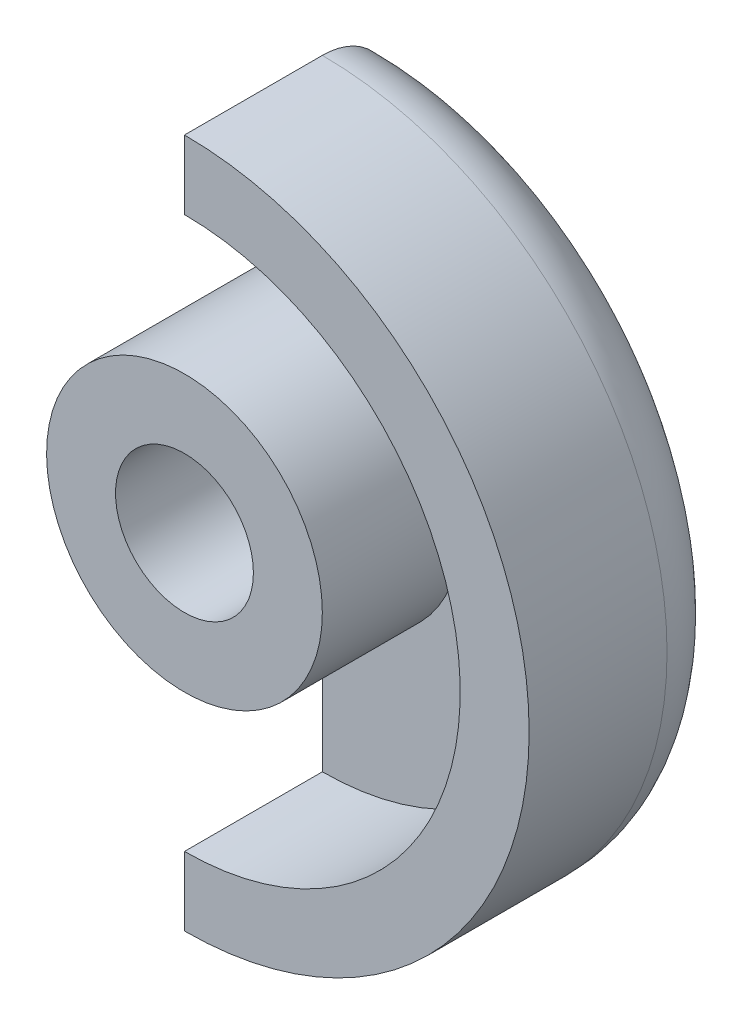
ISO-10303-21;
HEADER;
FILE_DESCRIPTION(('STEP AP214'),'2;1');
FILE_NAME('part.step','',(''),(''),'','','');
FILE_SCHEMA(('AUTOMOTIVE_DESIGN { 1 0 10303 214 1 1 1 1 }'));
ENDSEC;
DATA;
#1=APPLICATION_CONTEXT('core data for automotive mechanical design processes');
#2=APPLICATION_PROTOCOL_DEFINITION('international standard','automotive_design',2000,#1);
#3=PRODUCT_CONTEXT('',#1,'mechanical');
#4=PRODUCT('Part','Part','',(#3));
#5=PRODUCT_RELATED_PRODUCT_CATEGORY('part','',(#4));
#6=PRODUCT_DEFINITION_FORMATION('','',#4);
#7=PRODUCT_DEFINITION_CONTEXT('part definition',#1,'design');
#8=PRODUCT_DEFINITION('design','',#6,#7);
#9=PRODUCT_DEFINITION_SHAPE('','',#8);
#10=(LENGTH_UNIT() NAMED_UNIT(*) SI_UNIT(.MILLI.,.METRE.));
#11=(NAMED_UNIT(*) PLANE_ANGLE_UNIT() SI_UNIT($,.RADIAN.));
#12=(NAMED_UNIT(*) SI_UNIT($,.STERADIAN.) SOLID_ANGLE_UNIT());
#13=UNCERTAINTY_MEASURE_WITH_UNIT(LENGTH_MEASURE(1.E-05),#10,'distance_accuracy_value','');
#14=(GEOMETRIC_REPRESENTATION_CONTEXT(3) GLOBAL_UNCERTAINTY_ASSIGNED_CONTEXT((#13)) GLOBAL_UNIT_ASSIGNED_CONTEXT((#10,
#11,#12)) REPRESENTATION_CONTEXT('',''));
#15=CARTESIAN_POINT('',(0.,0.,0.));
#16=DIRECTION('',(0.,0.,1.));
#17=DIRECTION('',(1.,0.,0.));
#18=AXIS2_PLACEMENT_3D('',#15,#16,#17);
#19=CARTESIAN_POINT('',(0.,0.,0.));
#20=DIRECTION('',(0.,0.,1.));
#21=DIRECTION('',(1.,0.,0.));
#22=AXIS2_PLACEMENT_3D('',#19,#20,#21);
#23=PLANE('',#22);
#24=CARTESIAN_POINT('',(0.,0.,0.));
#25=DIRECTION('',(0.,0.,1.));
#26=DIRECTION('',(1.,0.,0.));
#27=AXIS2_PLACEMENT_3D('',#24,#25,#26);
#28=CIRCLE('',#27,2.);
#29=CARTESIAN_POINT('',(-0.666666666666667,-1.88561808316413,0.));
#30=VERTEX_POINT('',#29);
#31=CARTESIAN_POINT('',(-0.666666666666667,1.88561808316413,0.));
#32=VERTEX_POINT('',#31);
#33=EDGE_CURVE('E161',#30,#32,#28,.T.);
#34=ORIENTED_EDGE('',*,*,#33,.F.);
#35=CARTESIAN_POINT('',(-1.,-2.82842712474619,0.));
#36=DIRECTION('',(0.,0.,1.));
#37=DIRECTION('',(1.,0.,0.));
#38=AXIS2_PLACEMENT_3D('',#35,#36,#37);
#39=CIRCLE('',#38,1.);
#40=CARTESIAN_POINT('',(0.,-2.82842712474619,0.));
#41=VERTEX_POINT('',#40);
#42=EDGE_CURVE('E188',#30,#41,#39,.F.);
#43=ORIENTED_EDGE('',*,*,#42,.T.);
#44=DIRECTION('',(0.,-1.,0.));
#45=VECTOR('',#44,1.);
#46=CARTESIAN_POINT('',(0.,-2.,0.));
#47=LINE('',#46,#45);
#48=CARTESIAN_POINT('',(0.,-4.,0.));
#49=VERTEX_POINT('',#48);
#50=EDGE_CURVE('E146',#41,#49,#47,.T.);
#51=ORIENTED_EDGE('',*,*,#50,.T.);
#52=CARTESIAN_POINT('',(0.,0.,0.));
#53=DIRECTION('',(0.,0.,-1.));
#54=DIRECTION('',(1.,0.,0.));
#55=AXIS2_PLACEMENT_3D('',#52,#53,#54);
#56=CIRCLE('',#55,4.);
#57=CARTESIAN_POINT('',(0.,4.,0.));
#58=VERTEX_POINT('',#57);
#59=EDGE_CURVE('E135',#58,#49,#56,.T.);
#60=ORIENTED_EDGE('',*,*,#59,.F.);
#61=DIRECTION('',(0.,-1.,0.));
#62=VECTOR('',#61,1.);
#63=CARTESIAN_POINT('',(0.,5.,0.));
#64=LINE('',#63,#62);
#65=CARTESIAN_POINT('',(0.,2.82842712474619,0.));
#66=VERTEX_POINT('',#65);
#67=EDGE_CURVE('E150',#58,#66,#64,.T.);
#68=ORIENTED_EDGE('',*,*,#67,.T.);
#69=CARTESIAN_POINT('',(-1.,2.82842712474619,0.));
#70=DIRECTION('',(0.,0.,1.));
#71=DIRECTION('',(1.,0.,0.));
#72=AXIS2_PLACEMENT_3D('',#69,#70,#71);
#73=CIRCLE('',#72,1.);
#74=EDGE_CURVE('E50',#66,#32,#73,.F.);
#75=ORIENTED_EDGE('',*,*,#74,.T.);
#76=EDGE_LOOP('',(#34,#43,#51,#60,#68,#75));
#77=FACE_BOUND('',#76,.T.);
#78=ADVANCED_FACE('F41',(#77),#23,.T.);
#79=CARTESIAN_POINT('',(0.,0.,2.));
#80=DIRECTION('',(0.,0.,1.));
#81=DIRECTION('',(1.,0.,0.));
#82=AXIS2_PLACEMENT_3D('',#79,#80,#81);
#83=PLANE('',#82);
#84=CARTESIAN_POINT('',(0.,0.,2.));
#85=DIRECTION('',(0.,0.,1.));
#86=DIRECTION('',(1.,0.,0.));
#87=AXIS2_PLACEMENT_3D('',#84,#85,#86);
#88=CIRCLE('',#87,2.);
#89=CARTESIAN_POINT('',(2.,0.,2.));
#90=VERTEX_POINT('',#89);
#91=EDGE_CURVE('E162',#90,#90,#88,.T.);
#92=ORIENTED_EDGE('',*,*,#91,.T.);
#93=EDGE_LOOP('',(#92));
#94=FACE_BOUND('',#93,.T.);
#95=CARTESIAN_POINT('',(0.,0.,2.));
#96=DIRECTION('',(0.,0.,1.));
#97=DIRECTION('',(1.,0.,0.));
#98=AXIS2_PLACEMENT_3D('',#95,#96,#97);
#99=CIRCLE('',#98,1.);
#100=CARTESIAN_POINT('',(1.,0.,2.));
#101=VERTEX_POINT('',#100);
#102=EDGE_CURVE('E117',#101,#101,#99,.T.);
#103=ORIENTED_EDGE('',*,*,#102,.F.);
#104=EDGE_LOOP('',(#103));
#105=FACE_BOUND('',#104,.T.);
#106=ADVANCED_FACE('F220',(#94,#105),#83,.T.);
#107=CARTESIAN_POINT('',(0.,0.,2.));
#108=DIRECTION('',(0.,0.,-1.));
#109=DIRECTION('',(-1.,0.,0.));
#110=AXIS2_PLACEMENT_3D('',#107,#108,#109);
#111=CYLINDRICAL_SURFACE('',#110,2.);
#112=ORIENTED_EDGE('',*,*,#91,.F.);
#113=EDGE_LOOP('',(#112));
#114=FACE_BOUND('',#113,.T.);
#115=CARTESIAN_POINT('',(0.,0.,-1.));
#116=DIRECTION('',(0.,0.,1.));
#117=DIRECTION('',(1.,0.,0.));
#118=AXIS2_PLACEMENT_3D('',#115,#116,#117);
#119=CIRCLE('',#118,2.);
#120=CARTESIAN_POINT('',(-0.666666666666667,1.88561808316413,-1.));
#121=VERTEX_POINT('',#120);
#122=CARTESIAN_POINT('',(-0.666666666666667,-1.88561808316413,-1.));
#123=VERTEX_POINT('',#122);
#124=EDGE_CURVE('E147',#121,#123,#119,.T.);
#125=ORIENTED_EDGE('',*,*,#124,.T.);
#126=DIRECTION('',(0.,0.,-1.));
#127=VECTOR('',#126,1.);
#128=CARTESIAN_POINT('',(-0.666666666666667,-1.88561808316413,2.));
#129=LINE('',#128,#127);
#130=EDGE_CURVE('E173',#123,#30,#129,.F.);
#131=ORIENTED_EDGE('',*,*,#130,.T.);
#132=ORIENTED_EDGE('',*,*,#33,.T.);
#133=DIRECTION('',(0.,0.,-1.));
#134=VECTOR('',#133,1.);
#135=CARTESIAN_POINT('',(-0.666666666666667,1.88561808316413,2.));
#136=LINE('',#135,#134);
#137=EDGE_CURVE('E170',#32,#121,#136,.T.);
#138=ORIENTED_EDGE('',*,*,#137,.T.);
#139=EDGE_LOOP('',(#125,#131,#132,#138));
#140=FACE_BOUND('',#139,.T.);
#141=ADVANCED_FACE('F201',(#114,#140),#111,.T.);
#142=CARTESIAN_POINT('',(0.,0.,2.));
#143=DIRECTION('',(0.,0.,-1.));
#144=DIRECTION('',(-1.,0.,0.));
#145=AXIS2_PLACEMENT_3D('',#142,#143,#144);
#146=CYLINDRICAL_SURFACE('',#145,1.);
#147=CARTESIAN_POINT('',(0.,0.,0.));
#148=DIRECTION('',(0.,0.,1.));
#149=DIRECTION('',(1.,0.,0.));
#150=AXIS2_PLACEMENT_3D('',#147,#148,#149);
#151=CIRCLE('',#150,1.);
#152=CARTESIAN_POINT('',(1.,0.,0.));
#153=VERTEX_POINT('',#152);
#154=EDGE_CURVE('E167',#153,#153,#151,.F.);
#155=ORIENTED_EDGE('',*,*,#154,.T.);
#156=EDGE_LOOP('',(#155));
#157=FACE_BOUND('',#156,.T.);
#158=ORIENTED_EDGE('',*,*,#102,.T.);
#159=EDGE_LOOP('',(#158));
#160=FACE_BOUND('',#159,.T.);
#161=ADVANCED_FACE('F235',(#157,#160),#146,.F.);
#162=CARTESIAN_POINT('',(0.,5.,-1.));
#163=DIRECTION('',(-1.,0.,0.));
#164=DIRECTION('',(0.,0.,1.));
#165=AXIS2_PLACEMENT_3D('',#162,#163,#164);
#166=PLANE('',#165);
#167=DIRECTION('',(0.,-1.,0.));
#168=VECTOR('',#167,1.);
#169=CARTESIAN_POINT('',(0.,5.,-1.));
#170=LINE('',#169,#168);
#171=CARTESIAN_POINT('',(0.,4.,-1.));
#172=VERTEX_POINT('',#171);
#173=CARTESIAN_POINT('',(0.,2.82842712474619,-1.));
#174=VERTEX_POINT('',#173);
#175=EDGE_CURVE('E153',#172,#174,#170,.T.);
#176=ORIENTED_EDGE('',*,*,#175,.T.);
#177=DIRECTION('',(0.,0.,-1.));
#178=VECTOR('',#177,1.);
#179=CARTESIAN_POINT('',(0.,2.82842712474619,-1.));
#180=LINE('',#179,#178);
#181=EDGE_CURVE('E182',#174,#66,#180,.F.);
#182=ORIENTED_EDGE('',*,*,#181,.T.);
#183=ORIENTED_EDGE('',*,*,#67,.F.);
#184=DIRECTION('',(0.,0.,-1.));
#185=VECTOR('',#184,1.);
#186=CARTESIAN_POINT('',(0.,4.,2.));
#187=LINE('',#186,#185);
#188=CARTESIAN_POINT('',(0.,4.,2.));
#189=VERTEX_POINT('',#188);
#190=EDGE_CURVE('E126',#189,#58,#187,.T.);
#191=ORIENTED_EDGE('',*,*,#190,.F.);
#192=DIRECTION('',(0.,-1.,0.));
#193=VECTOR('',#192,1.);
#194=CARTESIAN_POINT('',(0.,5.,2.));
#195=LINE('',#194,#193);
#196=CARTESIAN_POINT('',(0.,5.,2.));
#197=VERTEX_POINT('',#196);
#198=EDGE_CURVE('E121',#197,#189,#195,.T.);
#199=ORIENTED_EDGE('',*,*,#198,.F.);
#200=DIRECTION('',(0.,0.,1.));
#201=VECTOR('',#200,1.);
#202=CARTESIAN_POINT('',(0.,5.,-1.));
#203=LINE('',#202,#201);
#204=CARTESIAN_POINT('',(0.,5.,0.));
#205=VERTEX_POINT('',#204);
#206=EDGE_CURVE('E108',#205,#197,#203,.T.);
#207=ORIENTED_EDGE('',*,*,#206,.F.);
#208=CARTESIAN_POINT('',(0.,4.,0.));
#209=DIRECTION('',(-1.,0.,0.));
#210=DIRECTION('',(0.,0.,1.));
#211=AXIS2_PLACEMENT_3D('',#208,#209,#210);
#212=CIRCLE('',#211,1.);
#213=EDGE_CURVE('E180',#205,#172,#212,.T.);
#214=ORIENTED_EDGE('',*,*,#213,.T.);
#215=EDGE_LOOP('',(#176,#182,#183,#191,#199,#207,#214));
#216=FACE_BOUND('',#215,.T.);
#217=ADVANCED_FACE('F123',(#216),#166,.T.);
#218=CARTESIAN_POINT('',(0.,0.,-1.));
#219=DIRECTION('',(0.,0.,1.));
#220=DIRECTION('',(1.,0.,0.));
#221=AXIS2_PLACEMENT_3D('',#218,#219,#220);
#222=CYLINDRICAL_SURFACE('',#221,5.);
#223=DIRECTION('',(0.,0.,1.));
#224=VECTOR('',#223,1.);
#225=CARTESIAN_POINT('',(0.,-5.,-1.));
#226=LINE('',#225,#224);
#227=CARTESIAN_POINT('',(0.,-5.,0.));
#228=VERTEX_POINT('',#227);
#229=CARTESIAN_POINT('',(0.,-5.,2.));
#230=VERTEX_POINT('',#229);
#231=EDGE_CURVE('E118',#228,#230,#226,.T.);
#232=ORIENTED_EDGE('',*,*,#231,.F.);
#233=CARTESIAN_POINT('',(0.,0.,0.));
#234=DIRECTION('',(0.,0.,1.));
#235=DIRECTION('',(1.,0.,0.));
#236=AXIS2_PLACEMENT_3D('',#233,#234,#235);
#237=CIRCLE('',#236,5.);
#238=EDGE_CURVE('E115',#228,#205,#237,.T.);
#239=ORIENTED_EDGE('',*,*,#238,.T.);
#240=ORIENTED_EDGE('',*,*,#206,.T.);
#241=CARTESIAN_POINT('',(0.,0.,2.));
#242=DIRECTION('',(0.,0.,1.));
#243=DIRECTION('',(1.,0.,0.));
#244=AXIS2_PLACEMENT_3D('',#241,#242,#243);
#245=CIRCLE('',#244,5.);
#246=EDGE_CURVE('E113',#230,#197,#245,.T.);
#247=ORIENTED_EDGE('',*,*,#246,.F.);
#248=EDGE_LOOP('',(#232,#239,#240,#247));
#249=FACE_BOUND('',#248,.T.);
#250=ADVANCED_FACE('F111',(#249),#222,.T.);
#251=CARTESIAN_POINT('',(0.,-2.,-1.));
#252=DIRECTION('',(-1.,0.,0.));
#253=DIRECTION('',(0.,0.,1.));
#254=AXIS2_PLACEMENT_3D('',#251,#252,#253);
#255=PLANE('',#254);
#256=ORIENTED_EDGE('',*,*,#50,.F.);
#257=DIRECTION('',(0.,0.,-1.));
#258=VECTOR('',#257,1.);
#259=CARTESIAN_POINT('',(0.,-2.82842712474619,-1.));
#260=LINE('',#259,#258);
#261=CARTESIAN_POINT('',(0.,-2.82842712474619,-1.));
#262=VERTEX_POINT('',#261);
#263=EDGE_CURVE('E178',#41,#262,#260,.T.);
#264=ORIENTED_EDGE('',*,*,#263,.T.);
#265=DIRECTION('',(0.,-1.,0.));
#266=VECTOR('',#265,1.);
#267=CARTESIAN_POINT('',(0.,-2.,-1.));
#268=LINE('',#267,#266);
#269=CARTESIAN_POINT('',(0.,-4.,-1.));
#270=VERTEX_POINT('',#269);
#271=EDGE_CURVE('E149',#262,#270,#268,.T.);
#272=ORIENTED_EDGE('',*,*,#271,.T.);
#273=CARTESIAN_POINT('',(0.,-4.,0.));
#274=DIRECTION('',(-1.,0.,0.));
#275=DIRECTION('',(0.,0.,1.));
#276=AXIS2_PLACEMENT_3D('',#273,#274,#275);
#277=CIRCLE('',#276,1.);
#278=EDGE_CURVE('E176',#270,#228,#277,.T.);
#279=ORIENTED_EDGE('',*,*,#278,.T.);
#280=ORIENTED_EDGE('',*,*,#231,.T.);
#281=DIRECTION('',(0.,-1.,0.));
#282=VECTOR('',#281,1.);
#283=CARTESIAN_POINT('',(0.,-4.,2.));
#284=LINE('',#283,#282);
#285=CARTESIAN_POINT('',(0.,-4.,2.));
#286=VERTEX_POINT('',#285);
#287=EDGE_CURVE('E134',#286,#230,#284,.T.);
#288=ORIENTED_EDGE('',*,*,#287,.F.);
#289=DIRECTION('',(0.,0.,-1.));
#290=VECTOR('',#289,1.);
#291=CARTESIAN_POINT('',(0.,-4.,2.));
#292=LINE('',#291,#290);
#293=EDGE_CURVE('E141',#286,#49,#292,.T.);
#294=ORIENTED_EDGE('',*,*,#293,.T.);
#295=EDGE_LOOP('',(#256,#264,#272,#279,#280,#288,#294));
#296=FACE_BOUND('',#295,.T.);
#297=ADVANCED_FACE('F238',(#296),#255,.T.);
#298=CARTESIAN_POINT('',(0.,0.,-1.));
#299=DIRECTION('',(0.,0.,1.));
#300=DIRECTION('',(1.,0.,0.));
#301=AXIS2_PLACEMENT_3D('',#298,#299,#300);
#302=PLANE('',#301);
#303=ORIENTED_EDGE('',*,*,#175,.F.);
#304=CARTESIAN_POINT('',(0.,0.,-1.));
#305=DIRECTION('',(0.,0.,1.));
#306=DIRECTION('',(1.,0.,0.));
#307=AXIS2_PLACEMENT_3D('',#304,#305,#306);
#308=CIRCLE('',#307,4.);
#309=EDGE_CURVE('E186',#172,#270,#308,.F.);
#310=ORIENTED_EDGE('',*,*,#309,.T.);
#311=ORIENTED_EDGE('',*,*,#271,.F.);
#312=CARTESIAN_POINT('',(-1.,-2.82842712474619,-1.));
#313=DIRECTION('',(0.,0.,1.));
#314=DIRECTION('',(1.,0.,0.));
#315=AXIS2_PLACEMENT_3D('',#312,#313,#314);
#316=CIRCLE('',#315,1.);
#317=EDGE_CURVE('E190',#262,#123,#316,.T.);
#318=ORIENTED_EDGE('',*,*,#317,.T.);
#319=CARTESIAN_POINT('',(0.,0.,-1.));
#320=DIRECTION('',(0.,0.,1.));
#321=DIRECTION('',(1.,0.,0.));
#322=AXIS2_PLACEMENT_3D('',#319,#320,#321);
#323=CIRCLE('',#322,2.);
#324=EDGE_CURVE('E56',#123,#121,#323,.T.);
#325=ORIENTED_EDGE('',*,*,#324,.T.);
#326=CARTESIAN_POINT('',(-1.,2.82842712474619,-1.));
#327=DIRECTION('',(0.,0.,1.));
#328=DIRECTION('',(1.,0.,0.));
#329=AXIS2_PLACEMENT_3D('',#326,#327,#328);
#330=CIRCLE('',#329,1.);
#331=EDGE_CURVE('E11',#121,#174,#330,.T.);
#332=ORIENTED_EDGE('',*,*,#331,.T.);
#333=EDGE_LOOP('',(#303,#310,#311,#318,#325,#332));
#334=FACE_BOUND('',#333,.T.);
#335=ADVANCED_FACE('F231',(#334),#302,.F.);
#336=CARTESIAN_POINT('',(0.,0.,2.));
#337=DIRECTION('',(0.,0.,-1.));
#338=DIRECTION('',(-1.,0.,0.));
#339=AXIS2_PLACEMENT_3D('',#336,#337,#338);
#340=CYLINDRICAL_SURFACE('',#339,4.);
#341=ORIENTED_EDGE('',*,*,#59,.T.);
#342=ORIENTED_EDGE('',*,*,#293,.F.);
#343=CARTESIAN_POINT('',(0.,0.,2.));
#344=DIRECTION('',(0.,0.,-1.));
#345=DIRECTION('',(1.,0.,0.));
#346=AXIS2_PLACEMENT_3D('',#343,#344,#345);
#347=CIRCLE('',#346,4.);
#348=EDGE_CURVE('E129',#189,#286,#347,.T.);
#349=ORIENTED_EDGE('',*,*,#348,.F.);
#350=ORIENTED_EDGE('',*,*,#190,.T.);
#351=EDGE_LOOP('',(#341,#342,#349,#350));
#352=FACE_BOUND('',#351,.T.);
#353=ADVANCED_FACE('F214',(#352),#340,.F.);
#354=CARTESIAN_POINT('',(0.,0.,2.));
#355=DIRECTION('',(0.,0.,1.));
#356=DIRECTION('',(1.,0.,0.));
#357=AXIS2_PLACEMENT_3D('',#354,#355,#356);
#358=PLANE('',#357);
#359=ORIENTED_EDGE('',*,*,#246,.T.);
#360=ORIENTED_EDGE('',*,*,#198,.T.);
#361=ORIENTED_EDGE('',*,*,#348,.T.);
#362=ORIENTED_EDGE('',*,*,#287,.T.);
#363=EDGE_LOOP('',(#359,#360,#361,#362));
#364=FACE_BOUND('',#363,.T.);
#365=ADVANCED_FACE('F132',(#364),#358,.T.);
#366=CARTESIAN_POINT('',(0.,0.,-1.));
#367=DIRECTION('',(0.,0.,-1.));
#368=DIRECTION('',(-1.,0.,0.));
#369=AXIS2_PLACEMENT_3D('',#366,#367,#368);
#370=CONICAL_SURFACE('',#369,2.,0.785398163397447);
#371=ORIENTED_EDGE('',*,*,#154,.F.);
#372=EDGE_LOOP('',(#371));
#373=FACE_BOUND('',#372,.T.);
#374=ORIENTED_EDGE('',*,*,#324,.F.);
#375=ORIENTED_EDGE('',*,*,#124,.F.);
#376=EDGE_LOOP('',(#374,#375));
#377=FACE_BOUND('',#376,.T.);
#378=ADVANCED_FACE('F202',(#373,#377),#370,.F.);
#379=CARTESIAN_POINT('',(-1.,-2.82842712474619,2.));
#380=DIRECTION('',(0.,0.,-1.));
#381=DIRECTION('',(-1.,0.,0.));
#382=AXIS2_PLACEMENT_3D('',#379,#380,#381);
#383=CYLINDRICAL_SURFACE('',#382,1.);
#384=ORIENTED_EDGE('',*,*,#317,.F.);
#385=ORIENTED_EDGE('',*,*,#263,.F.);
#386=ORIENTED_EDGE('',*,*,#42,.F.);
#387=ORIENTED_EDGE('',*,*,#130,.F.);
#388=EDGE_LOOP('',(#384,#385,#386,#387));
#389=FACE_BOUND('',#388,.T.);
#390=ADVANCED_FACE('F204',(#389),#383,.F.);
#391=CARTESIAN_POINT('',(-1.,2.82842712474619,2.));
#392=DIRECTION('',(0.,0.,-1.));
#393=DIRECTION('',(-1.,0.,0.));
#394=AXIS2_PLACEMENT_3D('',#391,#392,#393);
#395=CYLINDRICAL_SURFACE('',#394,1.);
#396=ORIENTED_EDGE('',*,*,#331,.F.);
#397=ORIENTED_EDGE('',*,*,#137,.F.);
#398=ORIENTED_EDGE('',*,*,#74,.F.);
#399=ORIENTED_EDGE('',*,*,#181,.F.);
#400=EDGE_LOOP('',(#396,#397,#398,#399));
#401=FACE_BOUND('',#400,.T.);
#402=ADVANCED_FACE('F199',(#401),#395,.F.);
#403=CARTESIAN_POINT('',(0.,0.,0.));
#404=DIRECTION('',(0.,0.,1.));
#405=DIRECTION('',(1.,0.,0.));
#406=AXIS2_PLACEMENT_3D('',#403,#404,#405);
#407=TOROIDAL_SURFACE('',#406,4.,1.);
#408=ORIENTED_EDGE('',*,*,#278,.F.);
#409=ORIENTED_EDGE('',*,*,#309,.F.);
#410=ORIENTED_EDGE('',*,*,#213,.F.);
#411=ORIENTED_EDGE('',*,*,#238,.F.);
#412=EDGE_LOOP('',(#408,#409,#410,#411));
#413=FACE_BOUND('',#412,.T.);
#414=ADVANCED_FACE('F43',(#413),#407,.T.);
#415=CLOSED_SHELL('',(#78,#106,#141,#161,#217,#250,#297,#335,#353,#365,#378,#390,#402,#414));
#416=MANIFOLD_SOLID_BREP('B2',#415);
#417=ADVANCED_BREP_SHAPE_REPRESENTATION('',(#18,#416),#14);
#418=SHAPE_DEFINITION_REPRESENTATION(#9,#417);
ENDSEC;
END-ISO-10303-21;
